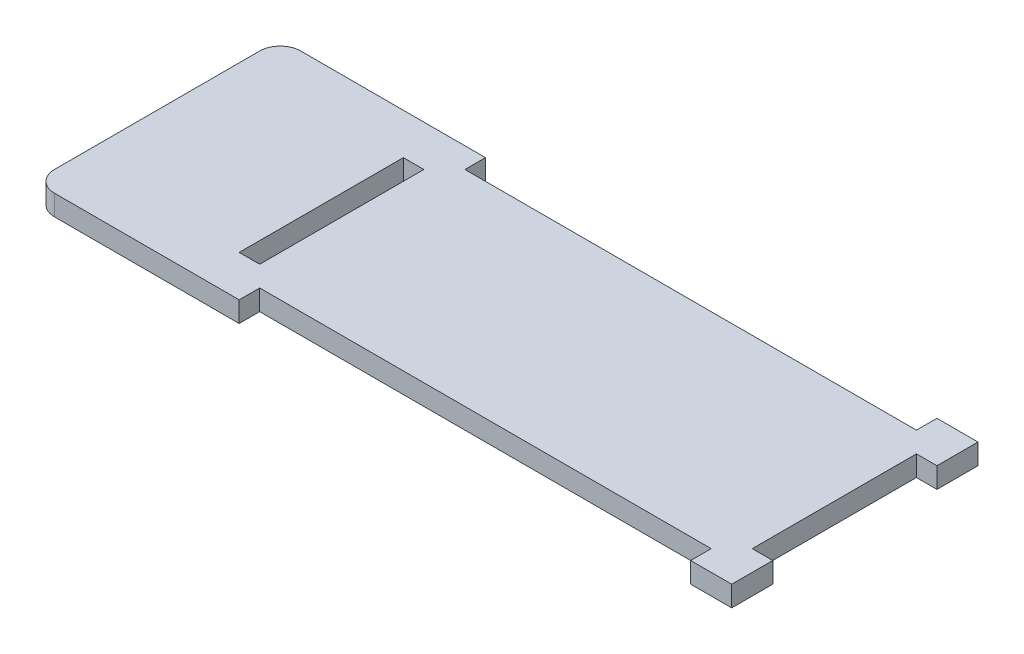
ISO-10303-21;
HEADER;
FILE_DESCRIPTION(('STEP AP214'),'2;1');
FILE_NAME('part.step','',(''),(''),'','','');
FILE_SCHEMA(('AUTOMOTIVE_DESIGN { 1 0 10303 214 1 1 1 1 }'));
ENDSEC;
DATA;
#1=APPLICATION_CONTEXT('core data for automotive mechanical design processes');
#2=APPLICATION_PROTOCOL_DEFINITION('international standard','automotive_design',2000,#1);
#3=PRODUCT_CONTEXT('',#1,'mechanical');
#4=PRODUCT('Part','Part','',(#3));
#5=PRODUCT_RELATED_PRODUCT_CATEGORY('part','',(#4));
#6=PRODUCT_DEFINITION_FORMATION('','',#4);
#7=PRODUCT_DEFINITION_CONTEXT('part definition',#1,'design');
#8=PRODUCT_DEFINITION('design','',#6,#7);
#9=PRODUCT_DEFINITION_SHAPE('','',#8);
#10=(LENGTH_UNIT() NAMED_UNIT(*) SI_UNIT(.MILLI.,.METRE.));
#11=(NAMED_UNIT(*) PLANE_ANGLE_UNIT() SI_UNIT($,.RADIAN.));
#12=(NAMED_UNIT(*) SI_UNIT($,.STERADIAN.) SOLID_ANGLE_UNIT());
#13=UNCERTAINTY_MEASURE_WITH_UNIT(LENGTH_MEASURE(1.E-05),#10,'distance_accuracy_value','');
#14=(GEOMETRIC_REPRESENTATION_CONTEXT(3) GLOBAL_UNCERTAINTY_ASSIGNED_CONTEXT((#13)) GLOBAL_UNIT_ASSIGNED_CONTEXT((#10,
#11,#12)) REPRESENTATION_CONTEXT('',''));
#15=CARTESIAN_POINT('',(0.,0.,0.));
#16=DIRECTION('',(0.,0.,1.));
#17=DIRECTION('',(1.,0.,0.));
#18=AXIS2_PLACEMENT_3D('',#15,#16,#17);
#19=CARTESIAN_POINT('',(-101.6,3.175,31.75));
#20=DIRECTION('',(0.,-1.,0.));
#21=DIRECTION('',(0.,0.,-1.));
#22=AXIS2_PLACEMENT_3D('',#19,#20,#21);
#23=PLANE('',#22);
#24=DIRECTION('',(-1.,0.,0.));
#25=VECTOR('',#24,1.);
#26=CARTESIAN_POINT('',(95.2499999999999,3.175,-38.1));
#27=LINE('',#26,#25);
#28=CARTESIAN_POINT('',(107.95,3.175,-38.1));
#29=VERTEX_POINT('',#28);
#30=CARTESIAN_POINT('',(95.2499999999999,3.175,-38.1));
#31=VERTEX_POINT('',#30);
#32=EDGE_CURVE('E218',#29,#31,#27,.T.);
#33=ORIENTED_EDGE('',*,*,#32,.T.);
#34=DIRECTION('',(0.,0.,1.));
#35=VECTOR('',#34,1.);
#36=CARTESIAN_POINT('',(95.2499999999999,3.175,-38.1));
#37=LINE('',#36,#35);
#38=CARTESIAN_POINT('',(95.2499999999999,3.175,-31.75));
#39=VERTEX_POINT('',#38);
#40=EDGE_CURVE('E221',#31,#39,#37,.T.);
#41=ORIENTED_EDGE('',*,*,#40,.T.);
#42=DIRECTION('',(-1.,0.,0.));
#43=VECTOR('',#42,1.);
#44=CARTESIAN_POINT('',(-44.45,3.175,-31.75));
#45=LINE('',#44,#43);
#46=CARTESIAN_POINT('',(-44.45,3.175,-31.75));
#47=VERTEX_POINT('',#46);
#48=EDGE_CURVE('E224',#39,#47,#45,.T.);
#49=ORIENTED_EDGE('',*,*,#48,.T.);
#50=DIRECTION('',(0.,0.,-1.));
#51=VECTOR('',#50,1.);
#52=CARTESIAN_POINT('',(-44.45,3.175,-38.1));
#53=LINE('',#52,#51);
#54=CARTESIAN_POINT('',(-44.45,3.175,-38.1));
#55=VERTEX_POINT('',#54);
#56=EDGE_CURVE('E226',#47,#55,#53,.T.);
#57=ORIENTED_EDGE('',*,*,#56,.T.);
#58=DIRECTION('',(-1.,0.,0.));
#59=VECTOR('',#58,1.);
#60=CARTESIAN_POINT('',(-101.6,3.175,-38.1));
#61=LINE('',#60,#59);
#62=CARTESIAN_POINT('',(-101.6,3.175,-38.1));
#63=VERTEX_POINT('',#62);
#64=EDGE_CURVE('E228',#55,#63,#61,.T.);
#65=ORIENTED_EDGE('',*,*,#64,.T.);
#66=CARTESIAN_POINT('',(-101.6,3.175,-31.75));
#67=DIRECTION('',(0.,1.,0.));
#68=DIRECTION('',(0.,0.,-1.));
#69=AXIS2_PLACEMENT_3D('',#66,#67,#68);
#70=CIRCLE('',#69,6.35);
#71=CARTESIAN_POINT('',(-107.95,3.175,-31.75));
#72=VERTEX_POINT('',#71);
#73=EDGE_CURVE('E230',#63,#72,#70,.T.);
#74=ORIENTED_EDGE('',*,*,#73,.T.);
#75=DIRECTION('',(0.,0.,1.));
#76=VECTOR('',#75,1.);
#77=CARTESIAN_POINT('',(-107.95,3.175,31.75));
#78=LINE('',#77,#76);
#79=CARTESIAN_POINT('',(-107.95,3.175,31.75));
#80=VERTEX_POINT('',#79);
#81=EDGE_CURVE('E232',#72,#80,#78,.T.);
#82=ORIENTED_EDGE('',*,*,#81,.T.);
#83=CARTESIAN_POINT('',(-101.6,3.175,31.75));
#84=DIRECTION('',(0.,1.,0.));
#85=DIRECTION('',(0.,0.,-1.));
#86=AXIS2_PLACEMENT_3D('',#83,#84,#85);
#87=CIRCLE('',#86,6.35);
#88=CARTESIAN_POINT('',(-101.6,3.175,38.1));
#89=VERTEX_POINT('',#88);
#90=EDGE_CURVE('E234',#80,#89,#87,.T.);
#91=ORIENTED_EDGE('',*,*,#90,.T.);
#92=DIRECTION('',(1.,0.,0.));
#93=VECTOR('',#92,1.);
#94=CARTESIAN_POINT('',(-101.6,3.175,38.1));
#95=LINE('',#94,#93);
#96=CARTESIAN_POINT('',(-44.45,3.175,38.1));
#97=VERTEX_POINT('',#96);
#98=EDGE_CURVE('E236',#89,#97,#95,.T.);
#99=ORIENTED_EDGE('',*,*,#98,.T.);
#100=DIRECTION('',(0.,0.,-1.));
#101=VECTOR('',#100,1.);
#102=CARTESIAN_POINT('',(-44.45,3.175,38.1));
#103=LINE('',#102,#101);
#104=CARTESIAN_POINT('',(-44.45,3.175,31.75));
#105=VERTEX_POINT('',#104);
#106=EDGE_CURVE('E238',#97,#105,#103,.T.);
#107=ORIENTED_EDGE('',*,*,#106,.T.);
#108=DIRECTION('',(1.,0.,0.));
#109=VECTOR('',#108,1.);
#110=CARTESIAN_POINT('',(-44.45,3.175,31.75));
#111=LINE('',#110,#109);
#112=CARTESIAN_POINT('',(95.2499999999999,3.175,31.75));
#113=VERTEX_POINT('',#112);
#114=EDGE_CURVE('E240',#105,#113,#111,.T.);
#115=ORIENTED_EDGE('',*,*,#114,.T.);
#116=DIRECTION('',(0.,0.,1.));
#117=VECTOR('',#116,1.);
#118=CARTESIAN_POINT('',(95.2499999999999,3.175,38.1));
#119=LINE('',#118,#117);
#120=CARTESIAN_POINT('',(95.2499999999999,3.175,38.1));
#121=VERTEX_POINT('',#120);
#122=EDGE_CURVE('E242',#113,#121,#119,.T.);
#123=ORIENTED_EDGE('',*,*,#122,.T.);
#124=DIRECTION('',(1.,0.,0.));
#125=VECTOR('',#124,1.);
#126=CARTESIAN_POINT('',(95.2499999999999,3.175,38.1));
#127=LINE('',#126,#125);
#128=CARTESIAN_POINT('',(107.95,3.175,38.1));
#129=VERTEX_POINT('',#128);
#130=EDGE_CURVE('E244',#121,#129,#127,.T.);
#131=ORIENTED_EDGE('',*,*,#130,.T.);
#132=DIRECTION('',(0.,0.,-1.));
#133=VECTOR('',#132,1.);
#134=CARTESIAN_POINT('',(107.95,3.175,38.1));
#135=LINE('',#134,#133);
#136=CARTESIAN_POINT('',(107.95,3.175,25.4));
#137=VERTEX_POINT('',#136);
#138=EDGE_CURVE('E246',#129,#137,#135,.T.);
#139=ORIENTED_EDGE('',*,*,#138,.T.);
#140=DIRECTION('',(-1.,0.,0.));
#141=VECTOR('',#140,1.);
#142=CARTESIAN_POINT('',(107.95,3.175,25.4));
#143=LINE('',#142,#141);
#144=CARTESIAN_POINT('',(101.6,3.175,25.4));
#145=VERTEX_POINT('',#144);
#146=EDGE_CURVE('E248',#137,#145,#143,.T.);
#147=ORIENTED_EDGE('',*,*,#146,.T.);
#148=DIRECTION('',(0.,0.,-1.));
#149=VECTOR('',#148,1.);
#150=CARTESIAN_POINT('',(101.6,3.175,-25.4));
#151=LINE('',#150,#149);
#152=CARTESIAN_POINT('',(101.6,3.175,-25.4));
#153=VERTEX_POINT('',#152);
#154=EDGE_CURVE('E250',#145,#153,#151,.T.);
#155=ORIENTED_EDGE('',*,*,#154,.T.);
#156=DIRECTION('',(1.,0.,0.));
#157=VECTOR('',#156,1.);
#158=CARTESIAN_POINT('',(107.95,3.175,-25.4));
#159=LINE('',#158,#157);
#160=CARTESIAN_POINT('',(107.95,3.175,-25.4));
#161=VERTEX_POINT('',#160);
#162=EDGE_CURVE('E252',#153,#161,#159,.T.);
#163=ORIENTED_EDGE('',*,*,#162,.T.);
#164=DIRECTION('',(0.,0.,-1.));
#165=VECTOR('',#164,1.);
#166=CARTESIAN_POINT('',(107.95,3.175,-25.4));
#167=LINE('',#166,#165);
#168=EDGE_CURVE('E254',#161,#29,#167,.T.);
#169=ORIENTED_EDGE('',*,*,#168,.T.);
#170=EDGE_LOOP('',(#33,#41,#49,#57,#65,#74,#82,#91,#99,#107,#115,#123,#131,#139,#147,#155,#163,#169));
#171=FACE_BOUND('',#170,.T.);
#172=DIRECTION('',(0.,0.,1.));
#173=VECTOR('',#172,1.);
#174=CARTESIAN_POINT('',(-57.15,3.175,-25.4));
#175=LINE('',#174,#173);
#176=CARTESIAN_POINT('',(-57.15,3.175,-25.4));
#177=VERTEX_POINT('',#176);
#178=CARTESIAN_POINT('',(-57.15,3.175,25.4));
#179=VERTEX_POINT('',#178);
#180=EDGE_CURVE('E182',#177,#179,#175,.T.);
#181=ORIENTED_EDGE('',*,*,#180,.F.);
#182=DIRECTION('',(-1.,0.,0.));
#183=VECTOR('',#182,1.);
#184=CARTESIAN_POINT('',(-57.15,3.175,-25.4));
#185=LINE('',#184,#183);
#186=CARTESIAN_POINT('',(-50.8,3.175,-25.4));
#187=VERTEX_POINT('',#186);
#188=EDGE_CURVE('E204',#187,#177,#185,.T.);
#189=ORIENTED_EDGE('',*,*,#188,.F.);
#190=DIRECTION('',(0.,0.,-1.));
#191=VECTOR('',#190,1.);
#192=CARTESIAN_POINT('',(-50.8,3.175,-25.4));
#193=LINE('',#192,#191);
#194=CARTESIAN_POINT('',(-50.8,3.175,25.4));
#195=VERTEX_POINT('',#194);
#196=EDGE_CURVE('E202',#195,#187,#193,.T.);
#197=ORIENTED_EDGE('',*,*,#196,.F.);
#198=DIRECTION('',(1.,0.,0.));
#199=VECTOR('',#198,1.);
#200=CARTESIAN_POINT('',(-57.15,3.175,25.4));
#201=LINE('',#200,#199);
#202=EDGE_CURVE('E190',#179,#195,#201,.T.);
#203=ORIENTED_EDGE('',*,*,#202,.F.);
#204=EDGE_LOOP('',(#181,#189,#197,#203));
#205=FACE_BOUND('',#204,.T.);
#206=ADVANCED_FACE('F33',(#171,#205),#23,.F.);
#207=CARTESIAN_POINT('',(-101.6,-3.175,31.75));
#208=DIRECTION('',(0.,-1.,0.));
#209=DIRECTION('',(0.,0.,-1.));
#210=AXIS2_PLACEMENT_3D('',#207,#208,#209);
#211=PLANE('',#210);
#212=DIRECTION('',(-1.,0.,0.));
#213=VECTOR('',#212,1.);
#214=CARTESIAN_POINT('',(95.2499999999999,-3.175,-38.1));
#215=LINE('',#214,#213);
#216=CARTESIAN_POINT('',(107.95,-3.175,-38.1));
#217=VERTEX_POINT('',#216);
#218=CARTESIAN_POINT('',(95.2499999999999,-3.175,-38.1));
#219=VERTEX_POINT('',#218);
#220=EDGE_CURVE('E198',#217,#219,#215,.T.);
#221=ORIENTED_EDGE('',*,*,#220,.F.);
#222=DIRECTION('',(0.,0.,-1.));
#223=VECTOR('',#222,1.);
#224=CARTESIAN_POINT('',(107.95,-3.175,-25.4));
#225=LINE('',#224,#223);
#226=CARTESIAN_POINT('',(107.95,-3.175,-25.4));
#227=VERTEX_POINT('',#226);
#228=EDGE_CURVE('E222',#227,#217,#225,.T.);
#229=ORIENTED_EDGE('',*,*,#228,.F.);
#230=DIRECTION('',(1.,0.,0.));
#231=VECTOR('',#230,1.);
#232=CARTESIAN_POINT('',(107.95,-3.175,-25.4));
#233=LINE('',#232,#231);
#234=CARTESIAN_POINT('',(101.6,-3.175,-25.4));
#235=VERTEX_POINT('',#234);
#236=EDGE_CURVE('E289',#235,#227,#233,.T.);
#237=ORIENTED_EDGE('',*,*,#236,.F.);
#238=DIRECTION('',(0.,0.,-1.));
#239=VECTOR('',#238,1.);
#240=CARTESIAN_POINT('',(101.6,-3.175,-25.4));
#241=LINE('',#240,#239);
#242=CARTESIAN_POINT('',(101.6,-3.175,25.4));
#243=VERTEX_POINT('',#242);
#244=EDGE_CURVE('E287',#243,#235,#241,.T.);
#245=ORIENTED_EDGE('',*,*,#244,.F.);
#246=DIRECTION('',(-1.,0.,0.));
#247=VECTOR('',#246,1.);
#248=CARTESIAN_POINT('',(107.95,-3.175,25.4));
#249=LINE('',#248,#247);
#250=CARTESIAN_POINT('',(107.95,-3.175,25.4));
#251=VERTEX_POINT('',#250);
#252=EDGE_CURVE('E285',#251,#243,#249,.T.);
#253=ORIENTED_EDGE('',*,*,#252,.F.);
#254=DIRECTION('',(0.,0.,-1.));
#255=VECTOR('',#254,1.);
#256=CARTESIAN_POINT('',(107.95,-3.175,38.1));
#257=LINE('',#256,#255);
#258=CARTESIAN_POINT('',(107.95,-3.175,38.1));
#259=VERTEX_POINT('',#258);
#260=EDGE_CURVE('E283',#259,#251,#257,.T.);
#261=ORIENTED_EDGE('',*,*,#260,.F.);
#262=DIRECTION('',(1.,0.,0.));
#263=VECTOR('',#262,1.);
#264=CARTESIAN_POINT('',(95.2499999999999,-3.175,38.1));
#265=LINE('',#264,#263);
#266=CARTESIAN_POINT('',(95.2499999999999,-3.175,38.1));
#267=VERTEX_POINT('',#266);
#268=EDGE_CURVE('E281',#267,#259,#265,.T.);
#269=ORIENTED_EDGE('',*,*,#268,.F.);
#270=DIRECTION('',(0.,0.,1.));
#271=VECTOR('',#270,1.);
#272=CARTESIAN_POINT('',(95.2499999999999,-3.175,38.1));
#273=LINE('',#272,#271);
#274=CARTESIAN_POINT('',(95.2499999999999,-3.175,31.75));
#275=VERTEX_POINT('',#274);
#276=EDGE_CURVE('E279',#275,#267,#273,.T.);
#277=ORIENTED_EDGE('',*,*,#276,.F.);
#278=DIRECTION('',(1.,0.,0.));
#279=VECTOR('',#278,1.);
#280=CARTESIAN_POINT('',(-44.45,-3.175,31.75));
#281=LINE('',#280,#279);
#282=CARTESIAN_POINT('',(-44.45,-3.175,31.75));
#283=VERTEX_POINT('',#282);
#284=EDGE_CURVE('E277',#283,#275,#281,.T.);
#285=ORIENTED_EDGE('',*,*,#284,.F.);
#286=DIRECTION('',(0.,0.,-1.));
#287=VECTOR('',#286,1.);
#288=CARTESIAN_POINT('',(-44.45,-3.175,38.1));
#289=LINE('',#288,#287);
#290=CARTESIAN_POINT('',(-44.45,-3.175,38.1));
#291=VERTEX_POINT('',#290);
#292=EDGE_CURVE('E275',#291,#283,#289,.T.);
#293=ORIENTED_EDGE('',*,*,#292,.F.);
#294=DIRECTION('',(1.,0.,0.));
#295=VECTOR('',#294,1.);
#296=CARTESIAN_POINT('',(-101.6,-3.175,38.1));
#297=LINE('',#296,#295);
#298=CARTESIAN_POINT('',(-101.6,-3.175,38.1));
#299=VERTEX_POINT('',#298);
#300=EDGE_CURVE('E273',#299,#291,#297,.T.);
#301=ORIENTED_EDGE('',*,*,#300,.F.);
#302=CARTESIAN_POINT('',(-101.6,-3.175,31.75));
#303=DIRECTION('',(0.,1.,0.));
#304=DIRECTION('',(0.,0.,-1.));
#305=AXIS2_PLACEMENT_3D('',#302,#303,#304);
#306=CIRCLE('',#305,6.35);
#307=CARTESIAN_POINT('',(-107.95,-3.175,31.75));
#308=VERTEX_POINT('',#307);
#309=EDGE_CURVE('E271',#308,#299,#306,.T.);
#310=ORIENTED_EDGE('',*,*,#309,.F.);
#311=DIRECTION('',(0.,0.,1.));
#312=VECTOR('',#311,1.);
#313=CARTESIAN_POINT('',(-107.95,-3.175,31.75));
#314=LINE('',#313,#312);
#315=CARTESIAN_POINT('',(-107.95,-3.175,-31.75));
#316=VERTEX_POINT('',#315);
#317=EDGE_CURVE('E269',#316,#308,#314,.T.);
#318=ORIENTED_EDGE('',*,*,#317,.F.);
#319=CARTESIAN_POINT('',(-101.6,-3.175,-31.75));
#320=DIRECTION('',(0.,1.,0.));
#321=DIRECTION('',(0.,0.,-1.));
#322=AXIS2_PLACEMENT_3D('',#319,#320,#321);
#323=CIRCLE('',#322,6.35);
#324=CARTESIAN_POINT('',(-101.6,-3.175,-38.1));
#325=VERTEX_POINT('',#324);
#326=EDGE_CURVE('E267',#325,#316,#323,.T.);
#327=ORIENTED_EDGE('',*,*,#326,.F.);
#328=DIRECTION('',(-1.,0.,0.));
#329=VECTOR('',#328,1.);
#330=CARTESIAN_POINT('',(-101.6,-3.175,-38.1));
#331=LINE('',#330,#329);
#332=CARTESIAN_POINT('',(-44.45,-3.175,-38.1));
#333=VERTEX_POINT('',#332);
#334=EDGE_CURVE('E265',#333,#325,#331,.T.);
#335=ORIENTED_EDGE('',*,*,#334,.F.);
#336=DIRECTION('',(0.,0.,-1.));
#337=VECTOR('',#336,1.);
#338=CARTESIAN_POINT('',(-44.45,-3.175,-38.1));
#339=LINE('',#338,#337);
#340=CARTESIAN_POINT('',(-44.45,-3.175,-31.75));
#341=VERTEX_POINT('',#340);
#342=EDGE_CURVE('E263',#341,#333,#339,.T.);
#343=ORIENTED_EDGE('',*,*,#342,.F.);
#344=DIRECTION('',(-1.,0.,0.));
#345=VECTOR('',#344,1.);
#346=CARTESIAN_POINT('',(-44.45,-3.175,-31.75));
#347=LINE('',#346,#345);
#348=CARTESIAN_POINT('',(95.2499999999999,-3.175,-31.75));
#349=VERTEX_POINT('',#348);
#350=EDGE_CURVE('E261',#349,#341,#347,.T.);
#351=ORIENTED_EDGE('',*,*,#350,.F.);
#352=DIRECTION('',(0.,0.,1.));
#353=VECTOR('',#352,1.);
#354=CARTESIAN_POINT('',(95.2499999999999,-3.175,-38.1));
#355=LINE('',#354,#353);
#356=EDGE_CURVE('E259',#219,#349,#355,.T.);
#357=ORIENTED_EDGE('',*,*,#356,.F.);
#358=EDGE_LOOP('',(#221,#229,#237,#245,#253,#261,#269,#277,#285,#293,#301,#310,#318,#327,#335,
#343,#351,#357));
#359=FACE_BOUND('',#358,.T.);
#360=DIRECTION('',(-1.,0.,0.));
#361=VECTOR('',#360,1.);
#362=CARTESIAN_POINT('',(-57.15,-3.175,-25.4));
#363=LINE('',#362,#361);
#364=CARTESIAN_POINT('',(-50.8,-3.175,-25.4));
#365=VERTEX_POINT('',#364);
#366=CARTESIAN_POINT('',(-57.15,-3.175,-25.4));
#367=VERTEX_POINT('',#366);
#368=EDGE_CURVE('E191',#365,#367,#363,.T.);
#369=ORIENTED_EDGE('',*,*,#368,.T.);
#370=DIRECTION('',(0.,0.,1.));
#371=VECTOR('',#370,1.);
#372=CARTESIAN_POINT('',(-57.15,-3.175,-25.4));
#373=LINE('',#372,#371);
#374=CARTESIAN_POINT('',(-57.15,-3.175,25.4));
#375=VERTEX_POINT('',#374);
#376=EDGE_CURVE('E56',#367,#375,#373,.T.);
#377=ORIENTED_EDGE('',*,*,#376,.T.);
#378=DIRECTION('',(1.,0.,0.));
#379=VECTOR('',#378,1.);
#380=CARTESIAN_POINT('',(-57.15,-3.175,25.4));
#381=LINE('',#380,#379);
#382=CARTESIAN_POINT('',(-50.8,-3.175,25.4));
#383=VERTEX_POINT('',#382);
#384=EDGE_CURVE('E197',#375,#383,#381,.T.);
#385=ORIENTED_EDGE('',*,*,#384,.T.);
#386=DIRECTION('',(0.,0.,-1.));
#387=VECTOR('',#386,1.);
#388=CARTESIAN_POINT('',(-50.8,-3.175,-25.4));
#389=LINE('',#388,#387);
#390=EDGE_CURVE('E210',#383,#365,#389,.T.);
#391=ORIENTED_EDGE('',*,*,#390,.T.);
#392=EDGE_LOOP('',(#369,#377,#385,#391));
#393=FACE_BOUND('',#392,.T.);
#394=ADVANCED_FACE('F349',(#359,#393),#211,.T.);
#395=CARTESIAN_POINT('',(95.2499999999999,3.175,-38.1));
#396=DIRECTION('',(0.,0.,1.));
#397=DIRECTION('',(1.,0.,0.));
#398=AXIS2_PLACEMENT_3D('',#395,#396,#397);
#399=PLANE('',#398);
#400=ORIENTED_EDGE('',*,*,#220,.T.);
#401=DIRECTION('',(0.,-1.,0.));
#402=VECTOR('',#401,1.);
#403=CARTESIAN_POINT('',(95.2499999999999,3.175,-38.1));
#404=LINE('',#403,#402);
#405=EDGE_CURVE('E11',#31,#219,#404,.T.);
#406=ORIENTED_EDGE('',*,*,#405,.F.);
#407=ORIENTED_EDGE('',*,*,#32,.F.);
#408=DIRECTION('',(0.,-1.,0.));
#409=VECTOR('',#408,1.);
#410=CARTESIAN_POINT('',(107.95,3.175,-38.1));
#411=LINE('',#410,#409);
#412=EDGE_CURVE('E256',#29,#217,#411,.T.);
#413=ORIENTED_EDGE('',*,*,#412,.T.);
#414=EDGE_LOOP('',(#400,#406,#407,#413));
#415=FACE_BOUND('',#414,.T.);
#416=ADVANCED_FACE('F35',(#415),#399,.F.);
#417=CARTESIAN_POINT('',(95.2499999999999,3.175,-38.1));
#418=DIRECTION('',(1.,0.,0.));
#419=DIRECTION('',(0.,0.,-1.));
#420=AXIS2_PLACEMENT_3D('',#417,#418,#419);
#421=PLANE('',#420);
#422=ORIENTED_EDGE('',*,*,#356,.T.);
#423=DIRECTION('',(0.,-1.,0.));
#424=VECTOR('',#423,1.);
#425=CARTESIAN_POINT('',(95.2499999999999,3.175,-31.75));
#426=LINE('',#425,#424);
#427=EDGE_CURVE('E41',#39,#349,#426,.T.);
#428=ORIENTED_EDGE('',*,*,#427,.F.);
#429=ORIENTED_EDGE('',*,*,#40,.F.);
#430=ORIENTED_EDGE('',*,*,#405,.T.);
#431=EDGE_LOOP('',(#422,#428,#429,#430));
#432=FACE_BOUND('',#431,.T.);
#433=ADVANCED_FACE('F366',(#432),#421,.F.);
#434=CARTESIAN_POINT('',(-44.45,3.175,-31.75));
#435=DIRECTION('',(0.,0.,1.));
#436=DIRECTION('',(1.,0.,0.));
#437=AXIS2_PLACEMENT_3D('',#434,#435,#436);
#438=PLANE('',#437);
#439=ORIENTED_EDGE('',*,*,#350,.T.);
#440=DIRECTION('',(0.,-1.,0.));
#441=VECTOR('',#440,1.);
#442=CARTESIAN_POINT('',(-44.45,3.175,-31.75));
#443=LINE('',#442,#441);
#444=EDGE_CURVE('E336',#47,#341,#443,.T.);
#445=ORIENTED_EDGE('',*,*,#444,.F.);
#446=ORIENTED_EDGE('',*,*,#48,.F.);
#447=ORIENTED_EDGE('',*,*,#427,.T.);
#448=EDGE_LOOP('',(#439,#445,#446,#447));
#449=FACE_BOUND('',#448,.T.);
#450=ADVANCED_FACE('F343',(#449),#438,.F.);
#451=CARTESIAN_POINT('',(-44.45,3.175,-38.1));
#452=DIRECTION('',(-1.,0.,0.));
#453=DIRECTION('',(0.,0.,1.));
#454=AXIS2_PLACEMENT_3D('',#451,#452,#453);
#455=PLANE('',#454);
#456=ORIENTED_EDGE('',*,*,#342,.T.);
#457=DIRECTION('',(0.,-1.,0.));
#458=VECTOR('',#457,1.);
#459=CARTESIAN_POINT('',(-44.45,3.175,-38.1));
#460=LINE('',#459,#458);
#461=EDGE_CURVE('E333',#55,#333,#460,.T.);
#462=ORIENTED_EDGE('',*,*,#461,.F.);
#463=ORIENTED_EDGE('',*,*,#56,.F.);
#464=ORIENTED_EDGE('',*,*,#444,.T.);
#465=EDGE_LOOP('',(#456,#462,#463,#464));
#466=FACE_BOUND('',#465,.T.);
#467=ADVANCED_FACE('F355',(#466),#455,.F.);
#468=CARTESIAN_POINT('',(-101.6,3.175,-38.1));
#469=DIRECTION('',(0.,0.,1.));
#470=DIRECTION('',(1.,0.,0.));
#471=AXIS2_PLACEMENT_3D('',#468,#469,#470);
#472=PLANE('',#471);
#473=ORIENTED_EDGE('',*,*,#334,.T.);
#474=DIRECTION('',(0.,-1.,0.));
#475=VECTOR('',#474,1.);
#476=CARTESIAN_POINT('',(-101.6,3.175,-38.1));
#477=LINE('',#476,#475);
#478=EDGE_CURVE('E330',#63,#325,#477,.T.);
#479=ORIENTED_EDGE('',*,*,#478,.F.);
#480=ORIENTED_EDGE('',*,*,#64,.F.);
#481=ORIENTED_EDGE('',*,*,#461,.T.);
#482=EDGE_LOOP('',(#473,#479,#480,#481));
#483=FACE_BOUND('',#482,.T.);
#484=ADVANCED_FACE('F359',(#483),#472,.F.);
#485=CARTESIAN_POINT('',(-101.6,3.175,-31.75));
#486=DIRECTION('',(0.,-1.,0.));
#487=DIRECTION('',(0.,0.,-1.));
#488=AXIS2_PLACEMENT_3D('',#485,#486,#487);
#489=CYLINDRICAL_SURFACE('',#488,6.35);
#490=ORIENTED_EDGE('',*,*,#326,.T.);
#491=DIRECTION('',(0.,-1.,0.));
#492=VECTOR('',#491,1.);
#493=CARTESIAN_POINT('',(-107.95,3.175,-31.75));
#494=LINE('',#493,#492);
#495=EDGE_CURVE('E327',#72,#316,#494,.T.);
#496=ORIENTED_EDGE('',*,*,#495,.F.);
#497=ORIENTED_EDGE('',*,*,#73,.F.);
#498=ORIENTED_EDGE('',*,*,#478,.T.);
#499=EDGE_LOOP('',(#490,#496,#497,#498));
#500=FACE_BOUND('',#499,.T.);
#501=ADVANCED_FACE('F429',(#500),#489,.T.);
#502=CARTESIAN_POINT('',(-107.95,3.175,31.75));
#503=DIRECTION('',(1.,0.,0.));
#504=DIRECTION('',(0.,0.,-1.));
#505=AXIS2_PLACEMENT_3D('',#502,#503,#504);
#506=PLANE('',#505);
#507=ORIENTED_EDGE('',*,*,#317,.T.);
#508=DIRECTION('',(0.,-1.,0.));
#509=VECTOR('',#508,1.);
#510=CARTESIAN_POINT('',(-107.95,3.175,31.75));
#511=LINE('',#510,#509);
#512=EDGE_CURVE('E324',#80,#308,#511,.T.);
#513=ORIENTED_EDGE('',*,*,#512,.F.);
#514=ORIENTED_EDGE('',*,*,#81,.F.);
#515=ORIENTED_EDGE('',*,*,#495,.T.);
#516=EDGE_LOOP('',(#507,#513,#514,#515));
#517=FACE_BOUND('',#516,.T.);
#518=ADVANCED_FACE('F427',(#517),#506,.F.);
#519=CARTESIAN_POINT('',(-101.6,3.175,31.75));
#520=DIRECTION('',(0.,-1.,0.));
#521=DIRECTION('',(0.,0.,-1.));
#522=AXIS2_PLACEMENT_3D('',#519,#520,#521);
#523=CYLINDRICAL_SURFACE('',#522,6.35);
#524=ORIENTED_EDGE('',*,*,#309,.T.);
#525=DIRECTION('',(0.,-1.,0.));
#526=VECTOR('',#525,1.);
#527=CARTESIAN_POINT('',(-101.6,3.175,38.1));
#528=LINE('',#527,#526);
#529=EDGE_CURVE('E321',#89,#299,#528,.T.);
#530=ORIENTED_EDGE('',*,*,#529,.F.);
#531=ORIENTED_EDGE('',*,*,#90,.F.);
#532=ORIENTED_EDGE('',*,*,#512,.T.);
#533=EDGE_LOOP('',(#524,#530,#531,#532));
#534=FACE_BOUND('',#533,.T.);
#535=ADVANCED_FACE('F423',(#534),#523,.T.);
#536=CARTESIAN_POINT('',(-101.6,3.175,38.1));
#537=DIRECTION('',(0.,0.,-1.));
#538=DIRECTION('',(-1.,0.,0.));
#539=AXIS2_PLACEMENT_3D('',#536,#537,#538);
#540=PLANE('',#539);
#541=ORIENTED_EDGE('',*,*,#300,.T.);
#542=DIRECTION('',(0.,-1.,0.));
#543=VECTOR('',#542,1.);
#544=CARTESIAN_POINT('',(-44.45,3.175,38.1));
#545=LINE('',#544,#543);
#546=EDGE_CURVE('E318',#97,#291,#545,.T.);
#547=ORIENTED_EDGE('',*,*,#546,.F.);
#548=ORIENTED_EDGE('',*,*,#98,.F.);
#549=ORIENTED_EDGE('',*,*,#529,.T.);
#550=EDGE_LOOP('',(#541,#547,#548,#549));
#551=FACE_BOUND('',#550,.T.);
#552=ADVANCED_FACE('F418',(#551),#540,.F.);
#553=CARTESIAN_POINT('',(-44.45,3.175,38.1));
#554=DIRECTION('',(-1.,0.,0.));
#555=DIRECTION('',(0.,0.,1.));
#556=AXIS2_PLACEMENT_3D('',#553,#554,#555);
#557=PLANE('',#556);
#558=ORIENTED_EDGE('',*,*,#292,.T.);
#559=DIRECTION('',(0.,-1.,0.));
#560=VECTOR('',#559,1.);
#561=CARTESIAN_POINT('',(-44.45,3.175,31.75));
#562=LINE('',#561,#560);
#563=EDGE_CURVE('E315',#105,#283,#562,.T.);
#564=ORIENTED_EDGE('',*,*,#563,.F.);
#565=ORIENTED_EDGE('',*,*,#106,.F.);
#566=ORIENTED_EDGE('',*,*,#546,.T.);
#567=EDGE_LOOP('',(#558,#564,#565,#566));
#568=FACE_BOUND('',#567,.T.);
#569=ADVANCED_FACE('F412',(#568),#557,.F.);
#570=CARTESIAN_POINT('',(-44.45,3.175,31.75));
#571=DIRECTION('',(0.,0.,-1.));
#572=DIRECTION('',(-1.,0.,0.));
#573=AXIS2_PLACEMENT_3D('',#570,#571,#572);
#574=PLANE('',#573);
#575=ORIENTED_EDGE('',*,*,#284,.T.);
#576=DIRECTION('',(0.,-1.,0.));
#577=VECTOR('',#576,1.);
#578=CARTESIAN_POINT('',(95.2499999999999,3.175,31.75));
#579=LINE('',#578,#577);
#580=EDGE_CURVE('E312',#113,#275,#579,.T.);
#581=ORIENTED_EDGE('',*,*,#580,.F.);
#582=ORIENTED_EDGE('',*,*,#114,.F.);
#583=ORIENTED_EDGE('',*,*,#563,.T.);
#584=EDGE_LOOP('',(#575,#581,#582,#583));
#585=FACE_BOUND('',#584,.T.);
#586=ADVANCED_FACE('F408',(#585),#574,.F.);
#587=CARTESIAN_POINT('',(95.2499999999999,3.175,38.1));
#588=DIRECTION('',(1.,0.,0.));
#589=DIRECTION('',(0.,0.,-1.));
#590=AXIS2_PLACEMENT_3D('',#587,#588,#589);
#591=PLANE('',#590);
#592=ORIENTED_EDGE('',*,*,#276,.T.);
#593=DIRECTION('',(0.,-1.,0.));
#594=VECTOR('',#593,1.);
#595=CARTESIAN_POINT('',(95.2499999999999,3.175,38.1));
#596=LINE('',#595,#594);
#597=EDGE_CURVE('E309',#121,#267,#596,.T.);
#598=ORIENTED_EDGE('',*,*,#597,.F.);
#599=ORIENTED_EDGE('',*,*,#122,.F.);
#600=ORIENTED_EDGE('',*,*,#580,.T.);
#601=EDGE_LOOP('',(#592,#598,#599,#600));
#602=FACE_BOUND('',#601,.T.);
#603=ADVANCED_FACE('F403',(#602),#591,.F.);
#604=CARTESIAN_POINT('',(95.2499999999999,3.175,38.1));
#605=DIRECTION('',(0.,0.,-1.));
#606=DIRECTION('',(-1.,0.,0.));
#607=AXIS2_PLACEMENT_3D('',#604,#605,#606);
#608=PLANE('',#607);
#609=ORIENTED_EDGE('',*,*,#268,.T.);
#610=DIRECTION('',(0.,-1.,0.));
#611=VECTOR('',#610,1.);
#612=CARTESIAN_POINT('',(107.95,3.175,38.1));
#613=LINE('',#612,#611);
#614=EDGE_CURVE('E306',#129,#259,#613,.T.);
#615=ORIENTED_EDGE('',*,*,#614,.F.);
#616=ORIENTED_EDGE('',*,*,#130,.F.);
#617=ORIENTED_EDGE('',*,*,#597,.T.);
#618=EDGE_LOOP('',(#609,#615,#616,#617));
#619=FACE_BOUND('',#618,.T.);
#620=ADVANCED_FACE('F397',(#619),#608,.F.);
#621=CARTESIAN_POINT('',(107.95,3.175,38.1));
#622=DIRECTION('',(-1.,0.,0.));
#623=DIRECTION('',(0.,0.,1.));
#624=AXIS2_PLACEMENT_3D('',#621,#622,#623);
#625=PLANE('',#624);
#626=ORIENTED_EDGE('',*,*,#260,.T.);
#627=DIRECTION('',(0.,-1.,0.));
#628=VECTOR('',#627,1.);
#629=CARTESIAN_POINT('',(107.95,3.175,25.4));
#630=LINE('',#629,#628);
#631=EDGE_CURVE('E303',#137,#251,#630,.T.);
#632=ORIENTED_EDGE('',*,*,#631,.F.);
#633=ORIENTED_EDGE('',*,*,#138,.F.);
#634=ORIENTED_EDGE('',*,*,#614,.T.);
#635=EDGE_LOOP('',(#626,#632,#633,#634));
#636=FACE_BOUND('',#635,.T.);
#637=ADVANCED_FACE('F393',(#636),#625,.F.);
#638=CARTESIAN_POINT('',(107.95,3.175,25.4));
#639=DIRECTION('',(0.,0.,1.));
#640=DIRECTION('',(1.,0.,0.));
#641=AXIS2_PLACEMENT_3D('',#638,#639,#640);
#642=PLANE('',#641);
#643=ORIENTED_EDGE('',*,*,#252,.T.);
#644=DIRECTION('',(0.,-1.,0.));
#645=VECTOR('',#644,1.);
#646=CARTESIAN_POINT('',(101.6,3.175,25.4));
#647=LINE('',#646,#645);
#648=EDGE_CURVE('E300',#145,#243,#647,.T.);
#649=ORIENTED_EDGE('',*,*,#648,.F.);
#650=ORIENTED_EDGE('',*,*,#146,.F.);
#651=ORIENTED_EDGE('',*,*,#631,.T.);
#652=EDGE_LOOP('',(#643,#649,#650,#651));
#653=FACE_BOUND('',#652,.T.);
#654=ADVANCED_FACE('F388',(#653),#642,.F.);
#655=CARTESIAN_POINT('',(101.6,3.175,-25.4));
#656=DIRECTION('',(-1.,0.,0.));
#657=DIRECTION('',(0.,0.,1.));
#658=AXIS2_PLACEMENT_3D('',#655,#656,#657);
#659=PLANE('',#658);
#660=ORIENTED_EDGE('',*,*,#244,.T.);
#661=DIRECTION('',(0.,-1.,0.));
#662=VECTOR('',#661,1.);
#663=CARTESIAN_POINT('',(101.6,3.175,-25.4));
#664=LINE('',#663,#662);
#665=EDGE_CURVE('E297',#153,#235,#664,.T.);
#666=ORIENTED_EDGE('',*,*,#665,.F.);
#667=ORIENTED_EDGE('',*,*,#154,.F.);
#668=ORIENTED_EDGE('',*,*,#648,.T.);
#669=EDGE_LOOP('',(#660,#666,#667,#668));
#670=FACE_BOUND('',#669,.T.);
#671=ADVANCED_FACE('F382',(#670),#659,.F.);
#672=CARTESIAN_POINT('',(107.95,3.175,-25.4));
#673=DIRECTION('',(0.,0.,-1.));
#674=DIRECTION('',(-1.,0.,0.));
#675=AXIS2_PLACEMENT_3D('',#672,#673,#674);
#676=PLANE('',#675);
#677=ORIENTED_EDGE('',*,*,#236,.T.);
#678=DIRECTION('',(0.,-1.,0.));
#679=VECTOR('',#678,1.);
#680=CARTESIAN_POINT('',(107.95,3.175,-25.4));
#681=LINE('',#680,#679);
#682=EDGE_CURVE('E294',#161,#227,#681,.T.);
#683=ORIENTED_EDGE('',*,*,#682,.F.);
#684=ORIENTED_EDGE('',*,*,#162,.F.);
#685=ORIENTED_EDGE('',*,*,#665,.T.);
#686=EDGE_LOOP('',(#677,#683,#684,#685));
#687=FACE_BOUND('',#686,.T.);
#688=ADVANCED_FACE('F378',(#687),#676,.F.);
#689=CARTESIAN_POINT('',(107.95,3.175,-25.4));
#690=DIRECTION('',(-1.,0.,0.));
#691=DIRECTION('',(0.,0.,1.));
#692=AXIS2_PLACEMENT_3D('',#689,#690,#691);
#693=PLANE('',#692);
#694=ORIENTED_EDGE('',*,*,#228,.T.);
#695=ORIENTED_EDGE('',*,*,#412,.F.);
#696=ORIENTED_EDGE('',*,*,#168,.F.);
#697=ORIENTED_EDGE('',*,*,#682,.T.);
#698=EDGE_LOOP('',(#694,#695,#696,#697));
#699=FACE_BOUND('',#698,.T.);
#700=ADVANCED_FACE('F373',(#699),#693,.F.);
#701=CARTESIAN_POINT('',(-57.15,3.175,-25.4));
#702=DIRECTION('',(1.,0.,0.));
#703=DIRECTION('',(0.,0.,-1.));
#704=AXIS2_PLACEMENT_3D('',#701,#702,#703);
#705=PLANE('',#704);
#706=ORIENTED_EDGE('',*,*,#376,.F.);
#707=DIRECTION('',(0.,-1.,0.));
#708=VECTOR('',#707,1.);
#709=CARTESIAN_POINT('',(-57.15,3.175,-25.4));
#710=LINE('',#709,#708);
#711=EDGE_CURVE('E186',#177,#367,#710,.T.);
#712=ORIENTED_EDGE('',*,*,#711,.F.);
#713=ORIENTED_EDGE('',*,*,#180,.T.);
#714=DIRECTION('',(0.,-1.,0.));
#715=VECTOR('',#714,1.);
#716=CARTESIAN_POINT('',(-57.15,3.175,25.4));
#717=LINE('',#716,#715);
#718=EDGE_CURVE('E185',#179,#375,#717,.T.);
#719=ORIENTED_EDGE('',*,*,#718,.T.);
#720=EDGE_LOOP('',(#706,#712,#713,#719));
#721=FACE_BOUND('',#720,.T.);
#722=ADVANCED_FACE('F184',(#721),#705,.T.);
#723=CARTESIAN_POINT('',(-57.15,3.175,25.4));
#724=DIRECTION('',(0.,0.,-1.));
#725=DIRECTION('',(-1.,0.,0.));
#726=AXIS2_PLACEMENT_3D('',#723,#724,#725);
#727=PLANE('',#726);
#728=ORIENTED_EDGE('',*,*,#384,.F.);
#729=ORIENTED_EDGE('',*,*,#718,.F.);
#730=ORIENTED_EDGE('',*,*,#202,.T.);
#731=DIRECTION('',(0.,-1.,0.));
#732=VECTOR('',#731,1.);
#733=CARTESIAN_POINT('',(-50.8,3.175,25.4));
#734=LINE('',#733,#732);
#735=EDGE_CURVE('E199',#195,#383,#734,.T.);
#736=ORIENTED_EDGE('',*,*,#735,.T.);
#737=EDGE_LOOP('',(#728,#729,#730,#736));
#738=FACE_BOUND('',#737,.T.);
#739=ADVANCED_FACE('F194',(#738),#727,.T.);
#740=CARTESIAN_POINT('',(-50.8,3.175,-25.4));
#741=DIRECTION('',(-1.,0.,0.));
#742=DIRECTION('',(0.,0.,1.));
#743=AXIS2_PLACEMENT_3D('',#740,#741,#742);
#744=PLANE('',#743);
#745=ORIENTED_EDGE('',*,*,#390,.F.);
#746=ORIENTED_EDGE('',*,*,#735,.F.);
#747=ORIENTED_EDGE('',*,*,#196,.T.);
#748=DIRECTION('',(0.,-1.,0.));
#749=VECTOR('',#748,1.);
#750=CARTESIAN_POINT('',(-50.8,3.175,-25.4));
#751=LINE('',#750,#749);
#752=EDGE_CURVE('E48',#187,#365,#751,.T.);
#753=ORIENTED_EDGE('',*,*,#752,.T.);
#754=EDGE_LOOP('',(#745,#746,#747,#753));
#755=FACE_BOUND('',#754,.T.);
#756=ADVANCED_FACE('F523',(#755),#744,.T.);
#757=CARTESIAN_POINT('',(-57.15,3.175,-25.4));
#758=DIRECTION('',(0.,0.,1.));
#759=DIRECTION('',(1.,0.,0.));
#760=AXIS2_PLACEMENT_3D('',#757,#758,#759);
#761=PLANE('',#760);
#762=ORIENTED_EDGE('',*,*,#368,.F.);
#763=ORIENTED_EDGE('',*,*,#752,.F.);
#764=ORIENTED_EDGE('',*,*,#188,.T.);
#765=ORIENTED_EDGE('',*,*,#711,.T.);
#766=EDGE_LOOP('',(#762,#763,#764,#765));
#767=FACE_BOUND('',#766,.T.);
#768=ADVANCED_FACE('F529',(#767),#761,.T.);
#769=CLOSED_SHELL('',(#206,#394,#416,#433,#450,#467,#484,#501,#518,#535,#552,#569,#586,#603,
#620,#637,#654,#671,#688,#700,#722,#739,#756,#768));
#770=MANIFOLD_SOLID_BREP('B2',#769);
#771=ADVANCED_BREP_SHAPE_REPRESENTATION('',(#18,#770),#14);
#772=SHAPE_DEFINITION_REPRESENTATION(#9,#771);
ENDSEC;
END-ISO-10303-21;
